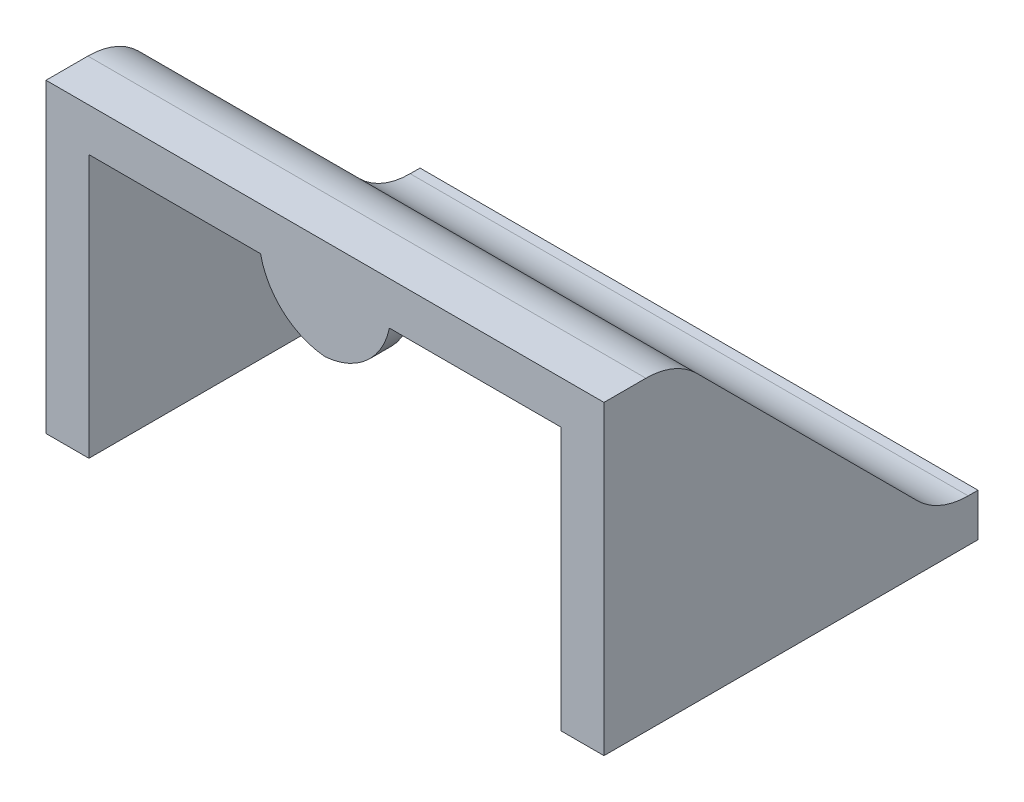
ISO-10303-21;
HEADER;
FILE_DESCRIPTION(('STEP AP214'),'2;1');
FILE_NAME('part.step','',(''),(''),'','','');
FILE_SCHEMA(('AUTOMOTIVE_DESIGN { 1 0 10303 214 1 1 1 1 }'));
ENDSEC;
DATA;
#1=APPLICATION_CONTEXT('core data for automotive mechanical design processes');
#2=APPLICATION_PROTOCOL_DEFINITION('international standard','automotive_design',2000,#1);
#3=PRODUCT_CONTEXT('',#1,'mechanical');
#4=PRODUCT('Part','Part','',(#3));
#5=PRODUCT_RELATED_PRODUCT_CATEGORY('part','',(#4));
#6=PRODUCT_DEFINITION_FORMATION('','',#4);
#7=PRODUCT_DEFINITION_CONTEXT('part definition',#1,'design');
#8=PRODUCT_DEFINITION('design','',#6,#7);
#9=PRODUCT_DEFINITION_SHAPE('','',#8);
#10=(LENGTH_UNIT() NAMED_UNIT(*) SI_UNIT(.MILLI.,.METRE.));
#11=(NAMED_UNIT(*) PLANE_ANGLE_UNIT() SI_UNIT($,.RADIAN.));
#12=(NAMED_UNIT(*) SI_UNIT($,.STERADIAN.) SOLID_ANGLE_UNIT());
#13=UNCERTAINTY_MEASURE_WITH_UNIT(LENGTH_MEASURE(1.E-05),#10,'distance_accuracy_value','');
#14=(GEOMETRIC_REPRESENTATION_CONTEXT(3) GLOBAL_UNCERTAINTY_ASSIGNED_CONTEXT((#13)) GLOBAL_UNIT_ASSIGNED_CONTEXT((#10,
#11,#12)) REPRESENTATION_CONTEXT('',''));
#15=CARTESIAN_POINT('',(0.,0.,0.));
#16=DIRECTION('',(0.,0.,1.));
#17=DIRECTION('',(1.,0.,0.));
#18=AXIS2_PLACEMENT_3D('',#15,#16,#17);
#19=CARTESIAN_POINT('',(-8.,15.3847763108502,29.1421356237309));
#20=DIRECTION('',(0.,-1.,0.));
#21=DIRECTION('',(0.,0.,-1.));
#22=AXIS2_PLACEMENT_3D('',#19,#20,#21);
#23=PLANE('',#22);
#24=DIRECTION('',(1.,0.,0.));
#25=VECTOR('',#24,1.);
#26=CARTESIAN_POINT('',(7.,15.3847763108502,27.6421356237309));
#27=LINE('',#26,#25);
#28=CARTESIAN_POINT('',(7.,15.3847763108502,27.6421356237309));
#29=VERTEX_POINT('',#28);
#30=CARTESIAN_POINT('',(16.,15.3847763108502,27.6421356237309));
#31=VERTEX_POINT('',#30);
#32=EDGE_CURVE('E145',#29,#31,#27,.T.);
#33=ORIENTED_EDGE('',*,*,#32,.F.);
#34=DIRECTION('',(0.,0.,-1.));
#35=VECTOR('',#34,1.);
#36=CARTESIAN_POINT('',(7.,15.3847763108502,29.1421356237309));
#37=LINE('',#36,#35);
#38=CARTESIAN_POINT('',(7.,15.3847763108502,29.1421356237309));
#39=VERTEX_POINT('',#38);
#40=EDGE_CURVE('E154',#39,#29,#37,.T.);
#41=ORIENTED_EDGE('',*,*,#40,.F.);
#42=DIRECTION('',(1.,0.,0.));
#43=VECTOR('',#42,1.);
#44=CARTESIAN_POINT('',(-8.,15.3847763108502,29.1421356237309));
#45=LINE('',#44,#43);
#46=CARTESIAN_POINT('',(-5.,15.3847763108502,29.1421356237309));
#47=VERTEX_POINT('',#46);
#48=EDGE_CURVE('E215',#47,#39,#45,.T.);
#49=ORIENTED_EDGE('',*,*,#48,.F.);
#50=DIRECTION('',(0.,0.,-1.));
#51=VECTOR('',#50,1.);
#52=CARTESIAN_POINT('',(-5.,15.3847763108502,29.1421356237309));
#53=LINE('',#52,#51);
#54=CARTESIAN_POINT('',(-5.,15.3847763108502,25.3847763108502));
#55=VERTEX_POINT('',#54);
#56=EDGE_CURVE('E164',#47,#55,#53,.T.);
#57=ORIENTED_EDGE('',*,*,#56,.T.);
#58=DIRECTION('',(1.,0.,0.));
#59=VECTOR('',#58,1.);
#60=CARTESIAN_POINT('',(-8.,15.3847763108502,25.3847763108502));
#61=LINE('',#60,#59);
#62=CARTESIAN_POINT('',(28.,15.3847763108502,25.3847763108502));
#63=VERTEX_POINT('',#62);
#64=EDGE_CURVE('E212',#55,#63,#61,.T.);
#65=ORIENTED_EDGE('',*,*,#64,.T.);
#66=DIRECTION('',(0.,0.,1.));
#67=VECTOR('',#66,1.);
#68=CARTESIAN_POINT('',(28.,15.3847763108502,29.1421356237309));
#69=LINE('',#68,#67);
#70=CARTESIAN_POINT('',(28.,15.3847763108502,29.1421356237309));
#71=VERTEX_POINT('',#70);
#72=EDGE_CURVE('E191',#63,#71,#69,.T.);
#73=ORIENTED_EDGE('',*,*,#72,.T.);
#74=CARTESIAN_POINT('',(16.,15.3847763108502,29.1421356237309));
#75=VERTEX_POINT('',#74);
#76=EDGE_CURVE('E217',#75,#71,#45,.T.);
#77=ORIENTED_EDGE('',*,*,#76,.F.);
#78=DIRECTION('',(0.,0.,1.));
#79=VECTOR('',#78,1.);
#80=CARTESIAN_POINT('',(16.,15.3847763108502,29.1421356237309));
#81=LINE('',#80,#79);
#82=EDGE_CURVE('E157',#31,#75,#81,.T.);
#83=ORIENTED_EDGE('',*,*,#82,.F.);
#84=EDGE_LOOP('',(#33,#41,#49,#57,#65,#73,#77,#83));
#85=FACE_BOUND('',#84,.T.);
#86=ADVANCED_FACE('F33',(#85),#23,.T.);
#87=CARTESIAN_POINT('',(0.,0.,3.));
#88=DIRECTION('',(0.,-1.,0.));
#89=DIRECTION('',(0.,0.,-1.));
#90=AXIS2_PLACEMENT_3D('',#87,#88,#89);
#91=PLANE('',#90);
#92=DIRECTION('',(0.,0.,-1.));
#93=VECTOR('',#92,1.);
#94=CARTESIAN_POINT('',(-8.,0.,10.));
#95=LINE('',#94,#93);
#96=CARTESIAN_POINT('',(-8.,0.,3.68629150101524));
#97=VERTEX_POINT('',#96);
#98=CARTESIAN_POINT('',(-8.,0.,3.));
#99=VERTEX_POINT('',#98);
#100=EDGE_CURVE('E235',#97,#99,#95,.T.);
#101=ORIENTED_EDGE('',*,*,#100,.F.);
#102=DIRECTION('',(1.,0.,0.));
#103=VECTOR('',#102,1.);
#104=CARTESIAN_POINT('',(0.,0.,3.68629150101524));
#105=LINE('',#104,#103);
#106=CARTESIAN_POINT('',(31.,0.,3.68629150101524));
#107=VERTEX_POINT('',#106);
#108=EDGE_CURVE('E255',#97,#107,#105,.T.);
#109=ORIENTED_EDGE('',*,*,#108,.T.);
#110=DIRECTION('',(0.,0.,-1.));
#111=VECTOR('',#110,1.);
#112=CARTESIAN_POINT('',(31.,0.,10.));
#113=LINE('',#112,#111);
#114=CARTESIAN_POINT('',(31.,0.,3.));
#115=VERTEX_POINT('',#114);
#116=EDGE_CURVE('E226',#107,#115,#113,.T.);
#117=ORIENTED_EDGE('',*,*,#116,.T.);
#118=DIRECTION('',(-1.,0.,0.));
#119=VECTOR('',#118,1.);
#120=CARTESIAN_POINT('',(-2.,0.,3.));
#121=LINE('',#120,#119);
#122=EDGE_CURVE('E214',#115,#99,#121,.T.);
#123=ORIENTED_EDGE('',*,*,#122,.T.);
#124=EDGE_LOOP('',(#101,#109,#117,#123));
#125=FACE_BOUND('',#124,.T.);
#126=ADVANCED_FACE('F277',(#125),#91,.F.);
#127=CARTESIAN_POINT('',(0.,0.,10.));
#128=DIRECTION('',(0.,0.,1.));
#129=DIRECTION('',(1.,0.,0.));
#130=AXIS2_PLACEMENT_3D('',#127,#128,#129);
#131=PLANE('',#130);
#132=DIRECTION('',(-1.,0.,0.));
#133=VECTOR('',#132,1.);
#134=CARTESIAN_POINT('',(25.,0.,10.));
#135=LINE('',#134,#133);
#136=CARTESIAN_POINT('',(28.,0.,10.));
#137=VERTEX_POINT('',#136);
#138=CARTESIAN_POINT('',(-5.,0.,10.));
#139=VERTEX_POINT('',#138);
#140=EDGE_CURVE('E220',#137,#139,#135,.T.);
#141=ORIENTED_EDGE('',*,*,#140,.T.);
#142=DIRECTION('',(0.,-1.,0.));
#143=VECTOR('',#142,1.);
#144=CARTESIAN_POINT('',(-5.,0.,10.));
#145=LINE('',#144,#143);
#146=CARTESIAN_POINT('',(-5.,-3.,10.));
#147=VERTEX_POINT('',#146);
#148=EDGE_CURVE('E170',#139,#147,#145,.T.);
#149=ORIENTED_EDGE('',*,*,#148,.T.);
#150=DIRECTION('',(1.,0.,0.));
#151=VECTOR('',#150,1.);
#152=CARTESIAN_POINT('',(0.,-3.,10.));
#153=LINE('',#152,#151);
#154=CARTESIAN_POINT('',(28.,-3.,10.));
#155=VERTEX_POINT('',#154);
#156=EDGE_CURVE('E223',#147,#155,#153,.T.);
#157=ORIENTED_EDGE('',*,*,#156,.T.);
#158=DIRECTION('',(0.,1.,0.));
#159=VECTOR('',#158,1.);
#160=CARTESIAN_POINT('',(28.,0.,10.));
#161=LINE('',#160,#159);
#162=EDGE_CURVE('E185',#155,#137,#161,.T.);
#163=ORIENTED_EDGE('',*,*,#162,.T.);
#164=EDGE_LOOP('',(#141,#149,#157,#163));
#165=FACE_BOUND('',#164,.T.);
#166=ADVANCED_FACE('F282',(#165),#131,.T.);
#167=CARTESIAN_POINT('',(-8.,0.,10.));
#168=DIRECTION('',(0.,-0.707106781186547,0.707106781186548));
#169=DIRECTION('',(0.,-0.707106781186548,-0.707106781186547));
#170=AXIS2_PLACEMENT_3D('',#167,#168,#169);
#171=PLANE('',#170);
#172=ORIENTED_EDGE('',*,*,#64,.F.);
#173=DIRECTION('',(0.,-0.707106781186548,-0.707106781186547));
#174=VECTOR('',#173,1.);
#175=CARTESIAN_POINT('',(-5.,15.3847763108502,25.3847763108502));
#176=LINE('',#175,#174);
#177=EDGE_CURVE('E167',#55,#139,#176,.T.);
#178=ORIENTED_EDGE('',*,*,#177,.T.);
#179=ORIENTED_EDGE('',*,*,#140,.F.);
#180=DIRECTION('',(0.,0.707106781186548,0.707106781186547));
#181=VECTOR('',#180,1.);
#182=CARTESIAN_POINT('',(28.,15.3847763108502,25.3847763108502));
#183=LINE('',#182,#181);
#184=EDGE_CURVE('E188',#137,#63,#183,.T.);
#185=ORIENTED_EDGE('',*,*,#184,.T.);
#186=EDGE_LOOP('',(#172,#178,#179,#185));
#187=FACE_BOUND('',#186,.T.);
#188=ADVANCED_FACE('F287',(#187),#171,.T.);
#189=CARTESIAN_POINT('',(0.,0.,3.));
#190=DIRECTION('',(0.,0.,1.));
#191=DIRECTION('',(1.,0.,0.));
#192=AXIS2_PLACEMENT_3D('',#189,#190,#191);
#193=PLANE('',#192);
#194=DIRECTION('',(0.,-1.,0.));
#195=VECTOR('',#194,1.);
#196=CARTESIAN_POINT('',(-8.,-3.,3.));
#197=LINE('',#196,#195);
#198=CARTESIAN_POINT('',(-8.,-3.,3.));
#199=VERTEX_POINT('',#198);
#200=EDGE_CURVE('E229',#99,#199,#197,.T.);
#201=ORIENTED_EDGE('',*,*,#200,.F.);
#202=ORIENTED_EDGE('',*,*,#122,.F.);
#203=DIRECTION('',(0.,1.,0.));
#204=VECTOR('',#203,1.);
#205=CARTESIAN_POINT('',(31.,-3.,3.));
#206=LINE('',#205,#204);
#207=CARTESIAN_POINT('',(31.,-3.,3.));
#208=VERTEX_POINT('',#207);
#209=EDGE_CURVE('E224',#208,#115,#206,.T.);
#210=ORIENTED_EDGE('',*,*,#209,.F.);
#211=DIRECTION('',(1.,0.,0.));
#212=VECTOR('',#211,1.);
#213=CARTESIAN_POINT('',(27.5724787771376,-3.,3.));
#214=LINE('',#213,#212);
#215=EDGE_CURVE('E232',#199,#208,#214,.T.);
#216=ORIENTED_EDGE('',*,*,#215,.F.);
#217=EDGE_LOOP('',(#201,#202,#210,#216));
#218=FACE_BOUND('',#217,.T.);
#219=ADVANCED_FACE('F304',(#218),#193,.F.);
#220=CARTESIAN_POINT('',(-8.,-3.,10.));
#221=DIRECTION('',(1.,0.,0.));
#222=DIRECTION('',(0.,0.,-1.));
#223=AXIS2_PLACEMENT_3D('',#220,#221,#222);
#224=PLANE('',#223);
#225=DIRECTION('',(0.,0.,1.));
#226=VECTOR('',#225,1.);
#227=CARTESIAN_POINT('',(-8.,18.3847763108502,29.1421356237309));
#228=LINE('',#227,#226);
#229=CARTESIAN_POINT('',(-8.,18.3847763108502,26.2132034355964));
#230=VERTEX_POINT('',#229);
#231=CARTESIAN_POINT('',(-8.,18.3847763108502,29.1421356237309));
#232=VERTEX_POINT('',#231);
#233=EDGE_CURVE('E200',#230,#232,#228,.T.);
#234=ORIENTED_EDGE('',*,*,#233,.F.);
#235=CARTESIAN_POINT('',(-8.,13.3847763108502,26.2132034355964));
#236=DIRECTION('',(1.,0.,0.));
#237=DIRECTION('',(0.,0.,-1.));
#238=AXIS2_PLACEMENT_3D('',#235,#236,#237);
#239=CIRCLE('',#238,5.);
#240=CARTESIAN_POINT('',(-8.,16.920310216783,22.6776695296637));
#241=VERTEX_POINT('',#240);
#242=EDGE_CURVE('E252',#230,#241,#239,.F.);
#243=ORIENTED_EDGE('',*,*,#242,.T.);
#244=DIRECTION('',(0.,0.707106781186547,0.707106781186548));
#245=VECTOR('',#244,1.);
#246=CARTESIAN_POINT('',(-8.,18.3847763108502,24.142135623731));
#247=LINE('',#246,#245);
#248=CARTESIAN_POINT('',(-8.,1.46446609406727,7.22182540694798));
#249=VERTEX_POINT('',#248);
#250=EDGE_CURVE('E198',#249,#241,#247,.T.);
#251=ORIENTED_EDGE('',*,*,#250,.F.);
#252=CARTESIAN_POINT('',(-8.,5.,3.68629150101524));
#253=DIRECTION('',(1.,0.,0.));
#254=DIRECTION('',(0.,0.,-1.));
#255=AXIS2_PLACEMENT_3D('',#252,#253,#254);
#256=CIRCLE('',#255,5.);
#257=EDGE_CURVE('E262',#249,#97,#256,.T.);
#258=ORIENTED_EDGE('',*,*,#257,.T.);
#259=ORIENTED_EDGE('',*,*,#100,.T.);
#260=ORIENTED_EDGE('',*,*,#200,.T.);
#261=DIRECTION('',(0.,0.,-1.));
#262=VECTOR('',#261,1.);
#263=CARTESIAN_POINT('',(-8.,-3.,10.));
#264=LINE('',#263,#262);
#265=CARTESIAN_POINT('',(-8.,-3.,29.1421356237309));
#266=VERTEX_POINT('',#265);
#267=EDGE_CURVE('E242',#266,#199,#264,.T.);
#268=ORIENTED_EDGE('',*,*,#267,.F.);
#269=DIRECTION('',(0.,-1.,0.));
#270=VECTOR('',#269,1.);
#271=CARTESIAN_POINT('',(-8.,18.3847763108502,29.1421356237309));
#272=LINE('',#271,#270);
#273=EDGE_CURVE('E203',#232,#266,#272,.T.);
#274=ORIENTED_EDGE('',*,*,#273,.F.);
#275=EDGE_LOOP('',(#234,#243,#251,#258,#259,#260,#268,#274));
#276=FACE_BOUND('',#275,.T.);
#277=ADVANCED_FACE('F307',(#276),#224,.F.);
#278=CARTESIAN_POINT('',(27.5724787771376,-3.,10.));
#279=DIRECTION('',(0.,1.,0.));
#280=DIRECTION('',(0.,0.,1.));
#281=AXIS2_PLACEMENT_3D('',#278,#279,#280);
#282=PLANE('',#281);
#283=ORIENTED_EDGE('',*,*,#267,.T.);
#284=ORIENTED_EDGE('',*,*,#215,.T.);
#285=DIRECTION('',(0.,0.,-1.));
#286=VECTOR('',#285,1.);
#287=CARTESIAN_POINT('',(31.,-3.,10.));
#288=LINE('',#287,#286);
#289=CARTESIAN_POINT('',(31.,-3.,29.1421356237309));
#290=VERTEX_POINT('',#289);
#291=EDGE_CURVE('E239',#290,#208,#288,.T.);
#292=ORIENTED_EDGE('',*,*,#291,.F.);
#293=DIRECTION('',(1.,0.,0.));
#294=VECTOR('',#293,1.);
#295=CARTESIAN_POINT('',(28.,-3.,29.1421356237309));
#296=LINE('',#295,#294);
#297=CARTESIAN_POINT('',(28.,-3.,29.1421356237309));
#298=VERTEX_POINT('',#297);
#299=EDGE_CURVE('E194',#298,#290,#296,.T.);
#300=ORIENTED_EDGE('',*,*,#299,.F.);
#301=DIRECTION('',(0.,0.,-1.));
#302=VECTOR('',#301,1.);
#303=CARTESIAN_POINT('',(28.,-3.,10.));
#304=LINE('',#303,#302);
#305=EDGE_CURVE('E182',#298,#155,#304,.T.);
#306=ORIENTED_EDGE('',*,*,#305,.T.);
#307=ORIENTED_EDGE('',*,*,#156,.F.);
#308=DIRECTION('',(0.,0.,1.));
#309=VECTOR('',#308,1.);
#310=CARTESIAN_POINT('',(-5.,-3.,10.));
#311=LINE('',#310,#309);
#312=CARTESIAN_POINT('',(-5.,-3.,29.1421356237309));
#313=VERTEX_POINT('',#312);
#314=EDGE_CURVE('E173',#147,#313,#311,.T.);
#315=ORIENTED_EDGE('',*,*,#314,.T.);
#316=DIRECTION('',(-1.,0.,0.));
#317=VECTOR('',#316,1.);
#318=CARTESIAN_POINT('',(-5.,-3.,29.1421356237309));
#319=LINE('',#318,#317);
#320=EDGE_CURVE('E176',#313,#266,#319,.T.);
#321=ORIENTED_EDGE('',*,*,#320,.T.);
#322=EDGE_LOOP('',(#283,#284,#292,#300,#306,#307,#315,#321));
#323=FACE_BOUND('',#322,.T.);
#324=ADVANCED_FACE('F311',(#323),#282,.F.);
#325=CARTESIAN_POINT('',(31.,-3.,10.));
#326=DIRECTION('',(-1.,0.,0.));
#327=DIRECTION('',(0.,0.,1.));
#328=AXIS2_PLACEMENT_3D('',#325,#326,#327);
#329=PLANE('',#328);
#330=ORIENTED_EDGE('',*,*,#116,.F.);
#331=CARTESIAN_POINT('',(31.,5.,3.68629150101524));
#332=DIRECTION('',(-1.,0.,0.));
#333=DIRECTION('',(0.,0.,1.));
#334=AXIS2_PLACEMENT_3D('',#331,#332,#333);
#335=CIRCLE('',#334,5.);
#336=CARTESIAN_POINT('',(31.,1.46446609406727,7.22182540694798));
#337=VERTEX_POINT('',#336);
#338=EDGE_CURVE('E260',#107,#337,#335,.T.);
#339=ORIENTED_EDGE('',*,*,#338,.T.);
#340=DIRECTION('',(0.,0.707106781186547,0.707106781186548));
#341=VECTOR('',#340,1.);
#342=CARTESIAN_POINT('',(31.,18.3847763108502,24.142135623731));
#343=LINE('',#342,#341);
#344=CARTESIAN_POINT('',(31.,16.920310216783,22.6776695296637));
#345=VERTEX_POINT('',#344);
#346=EDGE_CURVE('E197',#337,#345,#343,.T.);
#347=ORIENTED_EDGE('',*,*,#346,.T.);
#348=CARTESIAN_POINT('',(31.,13.3847763108502,26.2132034355964));
#349=DIRECTION('',(-1.,0.,0.));
#350=DIRECTION('',(0.,0.,1.));
#351=AXIS2_PLACEMENT_3D('',#348,#349,#350);
#352=CIRCLE('',#351,5.);
#353=CARTESIAN_POINT('',(31.,18.3847763108502,26.2132034355964));
#354=VERTEX_POINT('',#353);
#355=EDGE_CURVE('E248',#345,#354,#352,.F.);
#356=ORIENTED_EDGE('',*,*,#355,.T.);
#357=DIRECTION('',(0.,0.,1.));
#358=VECTOR('',#357,1.);
#359=CARTESIAN_POINT('',(31.,18.3847763108502,29.1421356237309));
#360=LINE('',#359,#358);
#361=CARTESIAN_POINT('',(31.,18.3847763108502,29.1421356237309));
#362=VERTEX_POINT('',#361);
#363=EDGE_CURVE('E208',#354,#362,#360,.T.);
#364=ORIENTED_EDGE('',*,*,#363,.T.);
#365=DIRECTION('',(0.,-1.,0.));
#366=VECTOR('',#365,1.);
#367=CARTESIAN_POINT('',(31.,18.3847763108502,29.1421356237309));
#368=LINE('',#367,#366);
#369=EDGE_CURVE('E201',#362,#290,#368,.T.);
#370=ORIENTED_EDGE('',*,*,#369,.T.);
#371=ORIENTED_EDGE('',*,*,#291,.T.);
#372=ORIENTED_EDGE('',*,*,#209,.T.);
#373=EDGE_LOOP('',(#330,#339,#347,#356,#364,#370,#371,#372));
#374=FACE_BOUND('',#373,.T.);
#375=ADVANCED_FACE('F292',(#374),#329,.F.);
#376=CARTESIAN_POINT('',(-8.,18.3847763108502,29.1421356237309));
#377=DIRECTION('',(0.,0.,1.));
#378=DIRECTION('',(1.,0.,0.));
#379=AXIS2_PLACEMENT_3D('',#376,#377,#378);
#380=PLANE('',#379);
#381=CARTESIAN_POINT('',(11.8989794855664,16.3847763108502,29.1421356237309));
#382=DIRECTION('',(0.,0.,1.));
#383=DIRECTION('',(1.,0.,0.));
#384=AXIS2_PLACEMENT_3D('',#381,#382,#383);
#385=CIRCLE('',#384,5.);
#386=CARTESIAN_POINT('',(11.5,11.4007201945834,29.1421356237309));
#387=VERTEX_POINT('',#386);
#388=EDGE_CURVE('E55',#39,#387,#385,.T.);
#389=ORIENTED_EDGE('',*,*,#388,.T.);
#390=CARTESIAN_POINT('',(11.1010205144336,16.3847763108502,29.1421356237309));
#391=DIRECTION('',(0.,0.,1.));
#392=DIRECTION('',(1.,0.,0.));
#393=AXIS2_PLACEMENT_3D('',#390,#391,#392);
#394=CIRCLE('',#393,5.);
#395=EDGE_CURVE('E150',#387,#75,#394,.T.);
#396=ORIENTED_EDGE('',*,*,#395,.T.);
#397=ORIENTED_EDGE('',*,*,#76,.T.);
#398=DIRECTION('',(0.,-1.,0.));
#399=VECTOR('',#398,1.);
#400=CARTESIAN_POINT('',(28.,-3.,29.1421356237309));
#401=LINE('',#400,#399);
#402=EDGE_CURVE('E179',#71,#298,#401,.T.);
#403=ORIENTED_EDGE('',*,*,#402,.T.);
#404=ORIENTED_EDGE('',*,*,#299,.T.);
#405=ORIENTED_EDGE('',*,*,#369,.F.);
#406=DIRECTION('',(1.,0.,0.));
#407=VECTOR('',#406,1.);
#408=CARTESIAN_POINT('',(-8.,18.3847763108502,29.1421356237309));
#409=LINE('',#408,#407);
#410=EDGE_CURVE('E206',#232,#362,#409,.T.);
#411=ORIENTED_EDGE('',*,*,#410,.F.);
#412=ORIENTED_EDGE('',*,*,#273,.T.);
#413=ORIENTED_EDGE('',*,*,#320,.F.);
#414=DIRECTION('',(0.,1.,0.));
#415=VECTOR('',#414,1.);
#416=CARTESIAN_POINT('',(-5.,-3.,29.1421356237309));
#417=LINE('',#416,#415);
#418=EDGE_CURVE('E162',#313,#47,#417,.T.);
#419=ORIENTED_EDGE('',*,*,#418,.T.);
#420=ORIENTED_EDGE('',*,*,#48,.T.);
#421=EDGE_LOOP('',(#389,#396,#397,#403,#404,#405,#411,#412,#413,#419,#420));
#422=FACE_BOUND('',#421,.T.);
#423=ADVANCED_FACE('F266',(#422),#380,.T.);
#424=CARTESIAN_POINT('',(-8.,18.3847763108502,29.1421356237309));
#425=DIRECTION('',(0.,1.,0.));
#426=DIRECTION('',(0.,0.,1.));
#427=AXIS2_PLACEMENT_3D('',#424,#425,#426);
#428=PLANE('',#427);
#429=ORIENTED_EDGE('',*,*,#363,.F.);
#430=DIRECTION('',(1.,0.,0.));
#431=VECTOR('',#430,1.);
#432=CARTESIAN_POINT('',(-8.,18.3847763108502,26.2132034355964));
#433=LINE('',#432,#431);
#434=EDGE_CURVE('E250',#354,#230,#433,.F.);
#435=ORIENTED_EDGE('',*,*,#434,.T.);
#436=ORIENTED_EDGE('',*,*,#233,.T.);
#437=ORIENTED_EDGE('',*,*,#410,.T.);
#438=EDGE_LOOP('',(#429,#435,#436,#437));
#439=FACE_BOUND('',#438,.T.);
#440=ADVANCED_FACE('F291',(#439),#428,.T.);
#441=CARTESIAN_POINT('',(-8.,18.3847763108502,24.142135623731));
#442=DIRECTION('',(0.,0.707106781186548,-0.707106781186547));
#443=DIRECTION('',(0.,0.707106781186547,0.707106781186548));
#444=AXIS2_PLACEMENT_3D('',#441,#442,#443);
#445=PLANE('',#444);
#446=ORIENTED_EDGE('',*,*,#346,.F.);
#447=DIRECTION('',(1.,0.,0.));
#448=VECTOR('',#447,1.);
#449=CARTESIAN_POINT('',(-8.,1.46446609406726,7.22182540694798));
#450=LINE('',#449,#448);
#451=EDGE_CURVE('E258',#337,#249,#450,.F.);
#452=ORIENTED_EDGE('',*,*,#451,.T.);
#453=ORIENTED_EDGE('',*,*,#250,.T.);
#454=DIRECTION('',(1.,0.,0.));
#455=VECTOR('',#454,1.);
#456=CARTESIAN_POINT('',(-8.,16.920310216783,22.6776695296637));
#457=LINE('',#456,#455);
#458=EDGE_CURVE('E234',#241,#345,#457,.T.);
#459=ORIENTED_EDGE('',*,*,#458,.T.);
#460=EDGE_LOOP('',(#446,#452,#453,#459));
#461=FACE_BOUND('',#460,.T.);
#462=ADVANCED_FACE('F295',(#461),#445,.T.);
#463=CARTESIAN_POINT('',(28.,0.,0.));
#464=DIRECTION('',(-1.,0.,0.));
#465=DIRECTION('',(0.,0.,1.));
#466=AXIS2_PLACEMENT_3D('',#463,#464,#465);
#467=PLANE('',#466);
#468=ORIENTED_EDGE('',*,*,#402,.F.);
#469=ORIENTED_EDGE('',*,*,#72,.F.);
#470=ORIENTED_EDGE('',*,*,#184,.F.);
#471=ORIENTED_EDGE('',*,*,#162,.F.);
#472=ORIENTED_EDGE('',*,*,#305,.F.);
#473=EDGE_LOOP('',(#468,#469,#470,#471,#472));
#474=FACE_BOUND('',#473,.T.);
#475=ADVANCED_FACE('F299',(#474),#467,.T.);
#476=CARTESIAN_POINT('',(-5.,0.,0.));
#477=DIRECTION('',(-1.,0.,0.));
#478=DIRECTION('',(0.,0.,1.));
#479=AXIS2_PLACEMENT_3D('',#476,#477,#478);
#480=PLANE('',#479);
#481=ORIENTED_EDGE('',*,*,#418,.F.);
#482=ORIENTED_EDGE('',*,*,#314,.F.);
#483=ORIENTED_EDGE('',*,*,#148,.F.);
#484=ORIENTED_EDGE('',*,*,#177,.F.);
#485=ORIENTED_EDGE('',*,*,#56,.F.);
#486=EDGE_LOOP('',(#481,#482,#483,#484,#485));
#487=FACE_BOUND('',#486,.T.);
#488=ADVANCED_FACE('F322',(#487),#480,.F.);
#489=CARTESIAN_POINT('',(-8.,13.3847763108502,26.2132034355964));
#490=DIRECTION('',(1.,0.,0.));
#491=DIRECTION('',(0.,0.,-1.));
#492=AXIS2_PLACEMENT_3D('',#489,#490,#491);
#493=CYLINDRICAL_SURFACE('',#492,5.);
#494=ORIENTED_EDGE('',*,*,#242,.F.);
#495=ORIENTED_EDGE('',*,*,#434,.F.);
#496=ORIENTED_EDGE('',*,*,#355,.F.);
#497=ORIENTED_EDGE('',*,*,#458,.F.);
#498=EDGE_LOOP('',(#494,#495,#496,#497));
#499=FACE_BOUND('',#498,.T.);
#500=ADVANCED_FACE('F319',(#499),#493,.T.);
#501=CARTESIAN_POINT('',(0.,5.,3.68629150101524));
#502=DIRECTION('',(1.,0.,0.));
#503=DIRECTION('',(0.,0.,-1.));
#504=AXIS2_PLACEMENT_3D('',#501,#502,#503);
#505=CYLINDRICAL_SURFACE('',#504,5.);
#506=ORIENTED_EDGE('',*,*,#257,.F.);
#507=ORIENTED_EDGE('',*,*,#451,.F.);
#508=ORIENTED_EDGE('',*,*,#338,.F.);
#509=ORIENTED_EDGE('',*,*,#108,.F.);
#510=EDGE_LOOP('',(#506,#507,#508,#509));
#511=FACE_BOUND('',#510,.T.);
#512=ADVANCED_FACE('F321',(#511),#505,.F.);
#513=CARTESIAN_POINT('',(7.,11.3847763108502,27.642135623731));
#514=DIRECTION('',(0.,0.,1.));
#515=DIRECTION('',(0.,-1.,0.));
#516=AXIS2_PLACEMENT_3D('',#513,#514,#515);
#517=PLANE('',#516);
#518=ORIENTED_EDGE('',*,*,#32,.T.);
#519=CARTESIAN_POINT('',(11.1010205144336,16.3847763108502,27.6421356237309));
#520=DIRECTION('',(0.,0.,1.));
#521=DIRECTION('',(0.,-1.,0.));
#522=AXIS2_PLACEMENT_3D('',#519,#520,#521);
#523=CIRCLE('',#522,5.);
#524=CARTESIAN_POINT('',(11.5,11.4007201945834,27.642135623731));
#525=VERTEX_POINT('',#524);
#526=EDGE_CURVE('E11',#31,#525,#523,.F.);
#527=ORIENTED_EDGE('',*,*,#526,.T.);
#528=CARTESIAN_POINT('',(11.8989794855664,16.3847763108502,27.6421356237309));
#529=DIRECTION('',(0.,0.,1.));
#530=DIRECTION('',(0.,-1.,0.));
#531=AXIS2_PLACEMENT_3D('',#528,#529,#530);
#532=CIRCLE('',#531,5.);
#533=EDGE_CURVE('E42',#525,#29,#532,.F.);
#534=ORIENTED_EDGE('',*,*,#533,.T.);
#535=EDGE_LOOP('',(#518,#527,#534));
#536=FACE_BOUND('',#535,.T.);
#537=ADVANCED_FACE('F144',(#536),#517,.F.);
#538=CARTESIAN_POINT('',(11.8989794855664,16.3847763108502,29.1421356237309));
#539=DIRECTION('',(0.,0.,-1.));
#540=DIRECTION('',(0.,1.,0.));
#541=AXIS2_PLACEMENT_3D('',#538,#539,#540);
#542=CYLINDRICAL_SURFACE('',#541,5.);
#543=ORIENTED_EDGE('',*,*,#40,.T.);
#544=ORIENTED_EDGE('',*,*,#533,.F.);
#545=DIRECTION('',(0.,0.,-1.));
#546=VECTOR('',#545,1.);
#547=CARTESIAN_POINT('',(11.5,11.4007201945834,28.392135623731));
#548=LINE('',#547,#546);
#549=EDGE_CURVE('E37',#387,#525,#548,.T.);
#550=ORIENTED_EDGE('',*,*,#549,.F.);
#551=ORIENTED_EDGE('',*,*,#388,.F.);
#552=EDGE_LOOP('',(#543,#544,#550,#551));
#553=FACE_BOUND('',#552,.T.);
#554=ADVANCED_FACE('F35',(#553),#542,.T.);
#555=CARTESIAN_POINT('',(11.1010205144336,16.3847763108502,29.1421356237309));
#556=DIRECTION('',(0.,0.,1.));
#557=DIRECTION('',(0.,-1.,0.));
#558=AXIS2_PLACEMENT_3D('',#555,#556,#557);
#559=CYLINDRICAL_SURFACE('',#558,5.);
#560=ORIENTED_EDGE('',*,*,#526,.F.);
#561=ORIENTED_EDGE('',*,*,#82,.T.);
#562=ORIENTED_EDGE('',*,*,#395,.F.);
#563=ORIENTED_EDGE('',*,*,#549,.T.);
#564=EDGE_LOOP('',(#560,#561,#562,#563));
#565=FACE_BOUND('',#564,.T.);
#566=ADVANCED_FACE('F270',(#565),#559,.T.);
#567=CLOSED_SHELL('',(#86,#126,#166,#188,#219,#277,#324,#375,#423,#440,#462,#475,#488,#500,#512,
#537,#554,#566));
#568=MANIFOLD_SOLID_BREP('B2',#567);
#569=ADVANCED_BREP_SHAPE_REPRESENTATION('',(#18,#568),#14);
#570=SHAPE_DEFINITION_REPRESENTATION(#9,#569);
ENDSEC;
END-ISO-10303-21;
